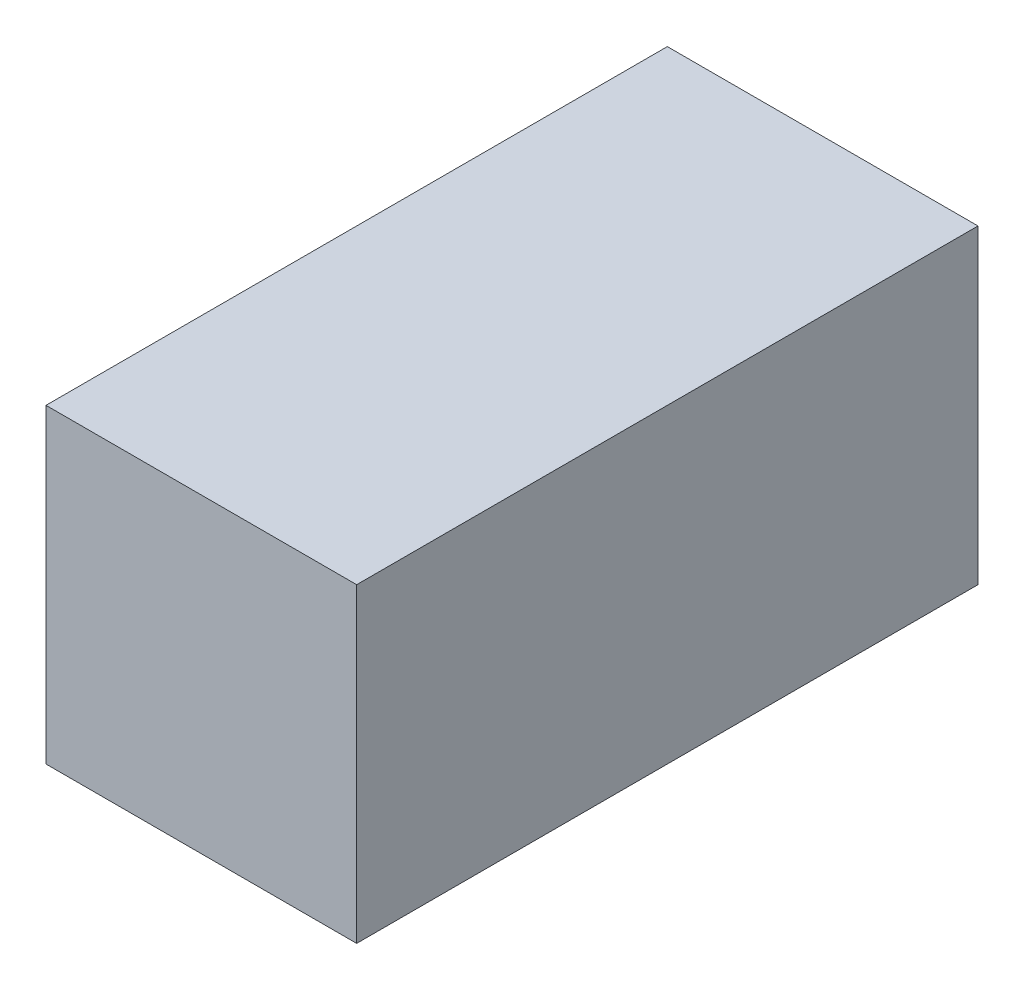
ISO-10303-21;
HEADER;
FILE_DESCRIPTION(('STEP AP214'),'2;1');
FILE_NAME('part.step','',(''),(''),'','','');
FILE_SCHEMA(('AUTOMOTIVE_DESIGN { 1 0 10303 214 1 1 1 1 }'));
ENDSEC;
DATA;
#1=APPLICATION_CONTEXT('core data for automotive mechanical design processes');
#2=APPLICATION_PROTOCOL_DEFINITION('international standard','automotive_design',2000,#1);
#3=PRODUCT_CONTEXT('',#1,'mechanical');
#4=PRODUCT('Part','Part','',(#3));
#5=PRODUCT_RELATED_PRODUCT_CATEGORY('part','',(#4));
#6=PRODUCT_DEFINITION_FORMATION('','',#4);
#7=PRODUCT_DEFINITION_CONTEXT('part definition',#1,'design');
#8=PRODUCT_DEFINITION('design','',#6,#7);
#9=PRODUCT_DEFINITION_SHAPE('','',#8);
#10=(LENGTH_UNIT() NAMED_UNIT(*) SI_UNIT(.MILLI.,.METRE.));
#11=(NAMED_UNIT(*) PLANE_ANGLE_UNIT() SI_UNIT($,.RADIAN.));
#12=(NAMED_UNIT(*) SI_UNIT($,.STERADIAN.) SOLID_ANGLE_UNIT());
#13=UNCERTAINTY_MEASURE_WITH_UNIT(LENGTH_MEASURE(1.E-05),#10,'distance_accuracy_value','');
#14=(GEOMETRIC_REPRESENTATION_CONTEXT(3) GLOBAL_UNCERTAINTY_ASSIGNED_CONTEXT((#13)) GLOBAL_UNIT_ASSIGNED_CONTEXT((#10,
#11,#12)) REPRESENTATION_CONTEXT('',''));
#15=CARTESIAN_POINT('',(0.,0.,0.));
#16=DIRECTION('',(0.,0.,1.));
#17=DIRECTION('',(1.,0.,0.));
#18=AXIS2_PLACEMENT_3D('',#15,#16,#17);
#19=CARTESIAN_POINT('',(75.,-75.,150.));
#20=DIRECTION('',(-1.,0.,0.));
#21=DIRECTION('',(0.,0.,1.));
#22=AXIS2_PLACEMENT_3D('',#19,#20,#21);
#23=PLANE('',#22);
#24=DIRECTION('',(0.,1.,0.));
#25=VECTOR('',#24,1.);
#26=CARTESIAN_POINT('',(75.,-75.,-150.));
#27=LINE('',#26,#25);
#28=CARTESIAN_POINT('',(75.,-75.,-150.));
#29=VERTEX_POINT('',#28);
#30=CARTESIAN_POINT('',(75.,75.,-150.));
#31=VERTEX_POINT('',#30);
#32=EDGE_CURVE('E98',#29,#31,#27,.T.);
#33=ORIENTED_EDGE('',*,*,#32,.T.);
#34=DIRECTION('',(0.,0.,-1.));
#35=VECTOR('',#34,1.);
#36=CARTESIAN_POINT('',(75.,75.,150.));
#37=LINE('',#36,#35);
#38=CARTESIAN_POINT('',(75.,75.,150.));
#39=VERTEX_POINT('',#38);
#40=EDGE_CURVE('E11',#39,#31,#37,.T.);
#41=ORIENTED_EDGE('',*,*,#40,.F.);
#42=DIRECTION('',(0.,1.,0.));
#43=VECTOR('',#42,1.);
#44=CARTESIAN_POINT('',(75.,-75.,150.));
#45=LINE('',#44,#43);
#46=CARTESIAN_POINT('',(75.,-75.,150.));
#47=VERTEX_POINT('',#46);
#48=EDGE_CURVE('E86',#47,#39,#45,.T.);
#49=ORIENTED_EDGE('',*,*,#48,.F.);
#50=DIRECTION('',(0.,0.,-1.));
#51=VECTOR('',#50,1.);
#52=CARTESIAN_POINT('',(75.,-75.,150.));
#53=LINE('',#52,#51);
#54=EDGE_CURVE('E94',#47,#29,#53,.T.);
#55=ORIENTED_EDGE('',*,*,#54,.T.);
#56=EDGE_LOOP('',(#33,#41,#49,#55));
#57=FACE_BOUND('',#56,.T.);
#58=ADVANCED_FACE('F35',(#57),#23,.F.);
#59=CARTESIAN_POINT('',(-75.,75.,150.));
#60=DIRECTION('',(0.,-1.,0.));
#61=DIRECTION('',(0.,0.,-1.));
#62=AXIS2_PLACEMENT_3D('',#59,#60,#61);
#63=PLANE('',#62);
#64=DIRECTION('',(-1.,0.,0.));
#65=VECTOR('',#64,1.);
#66=CARTESIAN_POINT('',(-75.,75.,-150.));
#67=LINE('',#66,#65);
#68=CARTESIAN_POINT('',(-75.,75.,-150.));
#69=VERTEX_POINT('',#68);
#70=EDGE_CURVE('E90',#31,#69,#67,.T.);
#71=ORIENTED_EDGE('',*,*,#70,.T.);
#72=DIRECTION('',(0.,0.,-1.));
#73=VECTOR('',#72,1.);
#74=CARTESIAN_POINT('',(-75.,75.,150.));
#75=LINE('',#74,#73);
#76=CARTESIAN_POINT('',(-75.,75.,150.));
#77=VERTEX_POINT('',#76);
#78=EDGE_CURVE('E43',#77,#69,#75,.T.);
#79=ORIENTED_EDGE('',*,*,#78,.F.);
#80=DIRECTION('',(-1.,0.,0.));
#81=VECTOR('',#80,1.);
#82=CARTESIAN_POINT('',(-75.,75.,150.));
#83=LINE('',#82,#81);
#84=EDGE_CURVE('E81',#39,#77,#83,.T.);
#85=ORIENTED_EDGE('',*,*,#84,.F.);
#86=ORIENTED_EDGE('',*,*,#40,.T.);
#87=EDGE_LOOP('',(#71,#79,#85,#86));
#88=FACE_BOUND('',#87,.T.);
#89=ADVANCED_FACE('F89',(#88),#63,.F.);
#90=CARTESIAN_POINT('',(-75.,-75.,150.));
#91=DIRECTION('',(1.,0.,0.));
#92=DIRECTION('',(0.,0.,-1.));
#93=AXIS2_PLACEMENT_3D('',#90,#91,#92);
#94=PLANE('',#93);
#95=DIRECTION('',(0.,-1.,0.));
#96=VECTOR('',#95,1.);
#97=CARTESIAN_POINT('',(-75.,-75.,-150.));
#98=LINE('',#97,#96);
#99=CARTESIAN_POINT('',(-75.,-75.,-150.));
#100=VERTEX_POINT('',#99);
#101=EDGE_CURVE('E68',#69,#100,#98,.T.);
#102=ORIENTED_EDGE('',*,*,#101,.T.);
#103=DIRECTION('',(0.,0.,-1.));
#104=VECTOR('',#103,1.);
#105=CARTESIAN_POINT('',(-75.,-75.,150.));
#106=LINE('',#105,#104);
#107=CARTESIAN_POINT('',(-75.,-75.,150.));
#108=VERTEX_POINT('',#107);
#109=EDGE_CURVE('E91',#108,#100,#106,.T.);
#110=ORIENTED_EDGE('',*,*,#109,.F.);
#111=DIRECTION('',(0.,-1.,0.));
#112=VECTOR('',#111,1.);
#113=CARTESIAN_POINT('',(-75.,-75.,150.));
#114=LINE('',#113,#112);
#115=EDGE_CURVE('E84',#77,#108,#114,.T.);
#116=ORIENTED_EDGE('',*,*,#115,.F.);
#117=ORIENTED_EDGE('',*,*,#78,.T.);
#118=EDGE_LOOP('',(#102,#110,#116,#117));
#119=FACE_BOUND('',#118,.T.);
#120=ADVANCED_FACE('F92',(#119),#94,.F.);
#121=CARTESIAN_POINT('',(-75.,-75.,150.));
#122=DIRECTION('',(0.,1.,0.));
#123=DIRECTION('',(0.,0.,1.));
#124=AXIS2_PLACEMENT_3D('',#121,#122,#123);
#125=PLANE('',#124);
#126=DIRECTION('',(1.,0.,0.));
#127=VECTOR('',#126,1.);
#128=CARTESIAN_POINT('',(-75.,-75.,-150.));
#129=LINE('',#128,#127);
#130=EDGE_CURVE('E74',#100,#29,#129,.T.);
#131=ORIENTED_EDGE('',*,*,#130,.T.);
#132=ORIENTED_EDGE('',*,*,#54,.F.);
#133=DIRECTION('',(1.,0.,0.));
#134=VECTOR('',#133,1.);
#135=CARTESIAN_POINT('',(-75.,-75.,150.));
#136=LINE('',#135,#134);
#137=EDGE_CURVE('E51',#108,#47,#136,.T.);
#138=ORIENTED_EDGE('',*,*,#137,.F.);
#139=ORIENTED_EDGE('',*,*,#109,.T.);
#140=EDGE_LOOP('',(#131,#132,#138,#139));
#141=FACE_BOUND('',#140,.T.);
#142=ADVANCED_FACE('F105',(#141),#125,.F.);
#143=CARTESIAN_POINT('',(0.,0.,150.));
#144=DIRECTION('',(0.,0.,-1.));
#145=DIRECTION('',(-1.,0.,0.));
#146=AXIS2_PLACEMENT_3D('',#143,#144,#145);
#147=PLANE('',#146);
#148=ORIENTED_EDGE('',*,*,#48,.T.);
#149=ORIENTED_EDGE('',*,*,#84,.T.);
#150=ORIENTED_EDGE('',*,*,#115,.T.);
#151=ORIENTED_EDGE('',*,*,#137,.T.);
#152=EDGE_LOOP('',(#148,#149,#150,#151));
#153=FACE_BOUND('',#152,.T.);
#154=ADVANCED_FACE('F82',(#153),#147,.F.);
#155=CARTESIAN_POINT('',(0.,0.,-150.));
#156=DIRECTION('',(0.,0.,-1.));
#157=DIRECTION('',(-1.,0.,0.));
#158=AXIS2_PLACEMENT_3D('',#155,#156,#157);
#159=PLANE('',#158);
#160=ORIENTED_EDGE('',*,*,#32,.F.);
#161=ORIENTED_EDGE('',*,*,#130,.F.);
#162=ORIENTED_EDGE('',*,*,#101,.F.);
#163=ORIENTED_EDGE('',*,*,#70,.F.);
#164=EDGE_LOOP('',(#160,#161,#162,#163));
#165=FACE_BOUND('',#164,.T.);
#166=ADVANCED_FACE('F108',(#165),#159,.T.);
#167=CLOSED_SHELL('',(#58,#89,#120,#142,#154,#166));
#168=MANIFOLD_SOLID_BREP('B2',#167);
#169=ADVANCED_BREP_SHAPE_REPRESENTATION('',(#18,#168),#14);
#170=SHAPE_DEFINITION_REPRESENTATION(#9,#169);
ENDSEC;
END-ISO-10303-21;
